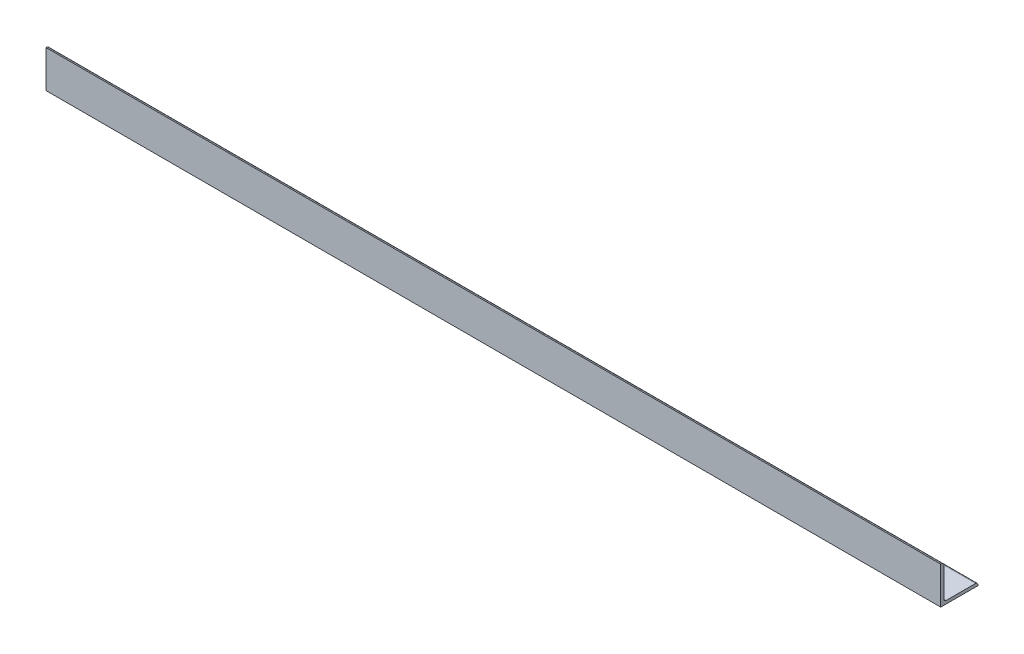
ISO-10303-21;
HEADER;
FILE_DESCRIPTION(('STEP AP214'),'2;1');
FILE_NAME('part.step','',(''),(''),'','','');
FILE_SCHEMA(('AUTOMOTIVE_DESIGN { 1 0 10303 214 1 1 1 1 }'));
ENDSEC;
DATA;
#1=APPLICATION_CONTEXT('core data for automotive mechanical design processes');
#2=APPLICATION_PROTOCOL_DEFINITION('international standard','automotive_design',2000,#1);
#3=PRODUCT_CONTEXT('',#1,'mechanical');
#4=PRODUCT('Part','Part','',(#3));
#5=PRODUCT_RELATED_PRODUCT_CATEGORY('part','',(#4));
#6=PRODUCT_DEFINITION_FORMATION('','',#4);
#7=PRODUCT_DEFINITION_CONTEXT('part definition',#1,'design');
#8=PRODUCT_DEFINITION('design','',#6,#7);
#9=PRODUCT_DEFINITION_SHAPE('','',#8);
#10=(LENGTH_UNIT() NAMED_UNIT(*) SI_UNIT(.MILLI.,.METRE.));
#11=(NAMED_UNIT(*) PLANE_ANGLE_UNIT() SI_UNIT($,.RADIAN.));
#12=(NAMED_UNIT(*) SI_UNIT($,.STERADIAN.) SOLID_ANGLE_UNIT());
#13=UNCERTAINTY_MEASURE_WITH_UNIT(LENGTH_MEASURE(1.E-05),#10,'distance_accuracy_value','');
#14=(GEOMETRIC_REPRESENTATION_CONTEXT(3) GLOBAL_UNCERTAINTY_ASSIGNED_CONTEXT((#13)) GLOBAL_UNIT_ASSIGNED_CONTEXT((#10,
#11,#12)) REPRESENTATION_CONTEXT('',''));
#15=CARTESIAN_POINT('',(0.,0.,0.));
#16=DIRECTION('',(0.,0.,1.));
#17=DIRECTION('',(1.,0.,0.));
#18=AXIS2_PLACEMENT_3D('',#15,#16,#17);
#19=CARTESIAN_POINT('',(-914.4,76.2,0.));
#20=DIRECTION('',(0.,1.,0.));
#21=DIRECTION('',(0.,0.,1.));
#22=AXIS2_PLACEMENT_3D('',#19,#20,#21);
#23=PLANE('',#22);
#24=DIRECTION('',(1.,0.,0.));
#25=VECTOR('',#24,1.);
#26=CARTESIAN_POINT('',(-914.4,76.2,0.));
#27=LINE('',#26,#25);
#28=CARTESIAN_POINT('',(-914.4,76.2,0.));
#29=VERTEX_POINT('',#28);
#30=CARTESIAN_POINT('',(914.4,76.2,0.));
#31=VERTEX_POINT('',#30);
#32=EDGE_CURVE('E41',#29,#31,#27,.T.);
#33=ORIENTED_EDGE('',*,*,#32,.T.);
#34=DIRECTION('',(0.,0.,1.));
#35=VECTOR('',#34,1.);
#36=CARTESIAN_POINT('',(914.4,76.2,0.));
#37=LINE('',#36,#35);
#38=CARTESIAN_POINT('',(914.4,76.2,-1.26999999999996));
#39=VERTEX_POINT('',#38);
#40=EDGE_CURVE('E109',#39,#31,#37,.T.);
#41=ORIENTED_EDGE('',*,*,#40,.F.);
#42=DIRECTION('',(1.,0.,0.));
#43=VECTOR('',#42,1.);
#44=CARTESIAN_POINT('',(-914.4,76.2,-1.26999999999996));
#45=LINE('',#44,#43);
#46=CARTESIAN_POINT('',(-914.4,76.2,-1.26999999999996));
#47=VERTEX_POINT('',#46);
#48=EDGE_CURVE('E11',#47,#39,#45,.T.);
#49=ORIENTED_EDGE('',*,*,#48,.F.);
#50=DIRECTION('',(0.,0.,1.));
#51=VECTOR('',#50,1.);
#52=CARTESIAN_POINT('',(-914.4,76.2,0.));
#53=LINE('',#52,#51);
#54=EDGE_CURVE('E110',#47,#29,#53,.T.);
#55=ORIENTED_EDGE('',*,*,#54,.T.);
#56=EDGE_LOOP('',(#33,#41,#49,#55));
#57=FACE_BOUND('',#56,.T.);
#58=ADVANCED_FACE('F38',(#57),#23,.T.);
#59=CARTESIAN_POINT('',(-914.4,71.12,-1.27));
#60=DIRECTION('',(1.,0.,0.));
#61=DIRECTION('',(0.,0.,-1.));
#62=AXIS2_PLACEMENT_3D('',#59,#60,#61);
#63=CYLINDRICAL_SURFACE('',#62,5.08);
#64=ORIENTED_EDGE('',*,*,#48,.T.);
#65=CARTESIAN_POINT('',(914.4,71.12,-1.27));
#66=DIRECTION('',(1.,0.,0.));
#67=DIRECTION('',(0.,0.,-1.));
#68=AXIS2_PLACEMENT_3D('',#65,#66,#67);
#69=CIRCLE('',#68,5.08);
#70=CARTESIAN_POINT('',(914.4,71.12,-6.35));
#71=VERTEX_POINT('',#70);
#72=EDGE_CURVE('E128',#71,#39,#69,.T.);
#73=ORIENTED_EDGE('',*,*,#72,.F.);
#74=DIRECTION('',(1.,0.,0.));
#75=VECTOR('',#74,1.);
#76=CARTESIAN_POINT('',(-914.4,71.12,-6.35));
#77=LINE('',#76,#75);
#78=CARTESIAN_POINT('',(-914.4,71.12,-6.35));
#79=VERTEX_POINT('',#78);
#80=EDGE_CURVE('E47',#79,#71,#77,.T.);
#81=ORIENTED_EDGE('',*,*,#80,.F.);
#82=CARTESIAN_POINT('',(-914.4,71.12,-1.27));
#83=DIRECTION('',(1.,0.,0.));
#84=DIRECTION('',(0.,0.,-1.));
#85=AXIS2_PLACEMENT_3D('',#82,#83,#84);
#86=CIRCLE('',#85,5.08);
#87=EDGE_CURVE('E116',#79,#47,#86,.T.);
#88=ORIENTED_EDGE('',*,*,#87,.T.);
#89=EDGE_LOOP('',(#64,#73,#81,#88));
#90=FACE_BOUND('',#89,.T.);
#91=ADVANCED_FACE('F211',(#90),#63,.T.);
#92=CARTESIAN_POINT('',(-914.4,71.12,-6.35));
#93=DIRECTION('',(0.,0.,-1.));
#94=DIRECTION('',(-1.,0.,0.));
#95=AXIS2_PLACEMENT_3D('',#92,#93,#94);
#96=PLANE('',#95);
#97=ORIENTED_EDGE('',*,*,#80,.T.);
#98=DIRECTION('',(0.,1.,0.));
#99=VECTOR('',#98,1.);
#100=CARTESIAN_POINT('',(914.4,71.12,-6.35));
#101=LINE('',#100,#99);
#102=CARTESIAN_POINT('',(914.4,11.43,-6.35));
#103=VERTEX_POINT('',#102);
#104=EDGE_CURVE('E144',#103,#71,#101,.T.);
#105=ORIENTED_EDGE('',*,*,#104,.F.);
#106=DIRECTION('',(1.,0.,0.));
#107=VECTOR('',#106,1.);
#108=CARTESIAN_POINT('',(-914.4,11.43,-6.35));
#109=LINE('',#108,#107);
#110=CARTESIAN_POINT('',(-914.4,11.43,-6.35));
#111=VERTEX_POINT('',#110);
#112=EDGE_CURVE('E170',#111,#103,#109,.T.);
#113=ORIENTED_EDGE('',*,*,#112,.F.);
#114=DIRECTION('',(0.,1.,0.));
#115=VECTOR('',#114,1.);
#116=CARTESIAN_POINT('',(-914.4,71.12,-6.35));
#117=LINE('',#116,#115);
#118=EDGE_CURVE('E165',#111,#79,#117,.T.);
#119=ORIENTED_EDGE('',*,*,#118,.T.);
#120=EDGE_LOOP('',(#97,#105,#113,#119));
#121=FACE_BOUND('',#120,.T.);
#122=ADVANCED_FACE('F209',(#121),#96,.T.);
#123=CARTESIAN_POINT('',(-914.4,11.43,-11.43));
#124=DIRECTION('',(1.,0.,0.));
#125=DIRECTION('',(0.,0.,-1.));
#126=AXIS2_PLACEMENT_3D('',#123,#124,#125);
#127=CYLINDRICAL_SURFACE('',#126,5.08);
#128=ORIENTED_EDGE('',*,*,#112,.T.);
#129=CARTESIAN_POINT('',(914.4,11.43,-11.43));
#130=DIRECTION('',(-1.,0.,0.));
#131=DIRECTION('',(0.,0.,-1.));
#132=AXIS2_PLACEMENT_3D('',#129,#130,#131);
#133=CIRCLE('',#132,5.08);
#134=CARTESIAN_POINT('',(914.4,6.35,-11.43));
#135=VERTEX_POINT('',#134);
#136=EDGE_CURVE('E141',#135,#103,#133,.T.);
#137=ORIENTED_EDGE('',*,*,#136,.F.);
#138=DIRECTION('',(1.,0.,0.));
#139=VECTOR('',#138,1.);
#140=CARTESIAN_POINT('',(-914.4,6.35,-11.43));
#141=LINE('',#140,#139);
#142=CARTESIAN_POINT('',(-914.4,6.35,-11.43));
#143=VERTEX_POINT('',#142);
#144=EDGE_CURVE('E173',#143,#135,#141,.T.);
#145=ORIENTED_EDGE('',*,*,#144,.F.);
#146=CARTESIAN_POINT('',(-914.4,11.43,-11.43));
#147=DIRECTION('',(-1.,0.,0.));
#148=DIRECTION('',(0.,0.,-1.));
#149=AXIS2_PLACEMENT_3D('',#146,#147,#148);
#150=CIRCLE('',#149,5.08);
#151=EDGE_CURVE('E162',#143,#111,#150,.T.);
#152=ORIENTED_EDGE('',*,*,#151,.T.);
#153=EDGE_LOOP('',(#128,#137,#145,#152));
#154=FACE_BOUND('',#153,.T.);
#155=ADVANCED_FACE('F207',(#154),#127,.F.);
#156=CARTESIAN_POINT('',(-914.4,6.35,-11.43));
#157=DIRECTION('',(0.,1.,0.));
#158=DIRECTION('',(0.,0.,1.));
#159=AXIS2_PLACEMENT_3D('',#156,#157,#158);
#160=PLANE('',#159);
#161=ORIENTED_EDGE('',*,*,#144,.T.);
#162=DIRECTION('',(0.,0.,1.));
#163=VECTOR('',#162,1.);
#164=CARTESIAN_POINT('',(914.4,6.35,-11.43));
#165=LINE('',#164,#163);
#166=CARTESIAN_POINT('',(914.4,6.35,-71.12));
#167=VERTEX_POINT('',#166);
#168=EDGE_CURVE('E138',#167,#135,#165,.T.);
#169=ORIENTED_EDGE('',*,*,#168,.F.);
#170=DIRECTION('',(1.,0.,0.));
#171=VECTOR('',#170,1.);
#172=CARTESIAN_POINT('',(-914.4,6.35,-71.12));
#173=LINE('',#172,#171);
#174=CARTESIAN_POINT('',(-914.4,6.35,-71.12));
#175=VERTEX_POINT('',#174);
#176=EDGE_CURVE('E176',#175,#167,#173,.T.);
#177=ORIENTED_EDGE('',*,*,#176,.F.);
#178=DIRECTION('',(0.,0.,1.));
#179=VECTOR('',#178,1.);
#180=CARTESIAN_POINT('',(-914.4,6.35,-11.43));
#181=LINE('',#180,#179);
#182=EDGE_CURVE('E159',#175,#143,#181,.T.);
#183=ORIENTED_EDGE('',*,*,#182,.T.);
#184=EDGE_LOOP('',(#161,#169,#177,#183));
#185=FACE_BOUND('',#184,.T.);
#186=ADVANCED_FACE('F202',(#185),#160,.T.);
#187=CARTESIAN_POINT('',(-914.4,1.27,-71.12));
#188=DIRECTION('',(1.,0.,0.));
#189=DIRECTION('',(0.,0.,-1.));
#190=AXIS2_PLACEMENT_3D('',#187,#188,#189);
#191=CYLINDRICAL_SURFACE('',#190,5.08);
#192=ORIENTED_EDGE('',*,*,#176,.T.);
#193=CARTESIAN_POINT('',(914.4,1.27,-71.12));
#194=DIRECTION('',(1.,0.,0.));
#195=DIRECTION('',(0.,0.,1.));
#196=AXIS2_PLACEMENT_3D('',#193,#194,#195);
#197=CIRCLE('',#196,5.08);
#198=CARTESIAN_POINT('',(914.4,1.26999999999996,-76.2));
#199=VERTEX_POINT('',#198);
#200=EDGE_CURVE('E135',#199,#167,#197,.T.);
#201=ORIENTED_EDGE('',*,*,#200,.F.);
#202=DIRECTION('',(1.,0.,0.));
#203=VECTOR('',#202,1.);
#204=CARTESIAN_POINT('',(-914.4,1.26999999999996,-76.2));
#205=LINE('',#204,#203);
#206=CARTESIAN_POINT('',(-914.4,1.26999999999996,-76.2));
#207=VERTEX_POINT('',#206);
#208=EDGE_CURVE('E179',#207,#199,#205,.T.);
#209=ORIENTED_EDGE('',*,*,#208,.F.);
#210=CARTESIAN_POINT('',(-914.4,1.27,-71.12));
#211=DIRECTION('',(1.,0.,0.));
#212=DIRECTION('',(0.,0.,1.));
#213=AXIS2_PLACEMENT_3D('',#210,#211,#212);
#214=CIRCLE('',#213,5.08);
#215=EDGE_CURVE('E156',#207,#175,#214,.T.);
#216=ORIENTED_EDGE('',*,*,#215,.T.);
#217=EDGE_LOOP('',(#192,#201,#209,#216));
#218=FACE_BOUND('',#217,.T.);
#219=ADVANCED_FACE('F195',(#218),#191,.T.);
#220=CARTESIAN_POINT('',(-914.4,1.26999999999996,-76.2));
#221=DIRECTION('',(0.,0.,-1.));
#222=DIRECTION('',(-1.,0.,0.));
#223=AXIS2_PLACEMENT_3D('',#220,#221,#222);
#224=PLANE('',#223);
#225=ORIENTED_EDGE('',*,*,#208,.T.);
#226=DIRECTION('',(0.,1.,0.));
#227=VECTOR('',#226,1.);
#228=CARTESIAN_POINT('',(914.4,1.26999999999996,-76.2));
#229=LINE('',#228,#227);
#230=CARTESIAN_POINT('',(914.4,0.,-76.2));
#231=VERTEX_POINT('',#230);
#232=EDGE_CURVE('E132',#231,#199,#229,.T.);
#233=ORIENTED_EDGE('',*,*,#232,.F.);
#234=DIRECTION('',(1.,0.,0.));
#235=VECTOR('',#234,1.);
#236=CARTESIAN_POINT('',(-914.4,0.,-76.2));
#237=LINE('',#236,#235);
#238=CARTESIAN_POINT('',(-914.4,0.,-76.2));
#239=VERTEX_POINT('',#238);
#240=EDGE_CURVE('E182',#239,#231,#237,.T.);
#241=ORIENTED_EDGE('',*,*,#240,.F.);
#242=DIRECTION('',(0.,1.,0.));
#243=VECTOR('',#242,1.);
#244=CARTESIAN_POINT('',(-914.4,1.26999999999996,-76.2));
#245=LINE('',#244,#243);
#246=EDGE_CURVE('E153',#239,#207,#245,.T.);
#247=ORIENTED_EDGE('',*,*,#246,.T.);
#248=EDGE_LOOP('',(#225,#233,#241,#247));
#249=FACE_BOUND('',#248,.T.);
#250=ADVANCED_FACE('F192',(#249),#224,.T.);
#251=CARTESIAN_POINT('',(-914.4,0.,0.));
#252=DIRECTION('',(0.,-1.,0.));
#253=DIRECTION('',(0.,0.,-1.));
#254=AXIS2_PLACEMENT_3D('',#251,#252,#253);
#255=PLANE('',#254);
#256=ORIENTED_EDGE('',*,*,#240,.T.);
#257=DIRECTION('',(0.,0.,-1.));
#258=VECTOR('',#257,1.);
#259=CARTESIAN_POINT('',(914.4,0.,0.));
#260=LINE('',#259,#258);
#261=CARTESIAN_POINT('',(914.4,0.,0.));
#262=VERTEX_POINT('',#261);
#263=EDGE_CURVE('E123',#262,#231,#260,.T.);
#264=ORIENTED_EDGE('',*,*,#263,.F.);
#265=DIRECTION('',(1.,0.,0.));
#266=VECTOR('',#265,1.);
#267=CARTESIAN_POINT('',(-914.4,0.,0.));
#268=LINE('',#267,#266);
#269=CARTESIAN_POINT('',(-914.4,0.,0.));
#270=VERTEX_POINT('',#269);
#271=EDGE_CURVE('E115',#270,#262,#268,.T.);
#272=ORIENTED_EDGE('',*,*,#271,.F.);
#273=DIRECTION('',(0.,0.,-1.));
#274=VECTOR('',#273,1.);
#275=CARTESIAN_POINT('',(-914.4,0.,0.));
#276=LINE('',#275,#274);
#277=EDGE_CURVE('E150',#270,#239,#276,.T.);
#278=ORIENTED_EDGE('',*,*,#277,.T.);
#279=EDGE_LOOP('',(#256,#264,#272,#278));
#280=FACE_BOUND('',#279,.T.);
#281=ADVANCED_FACE('F186',(#280),#255,.T.);
#282=CARTESIAN_POINT('',(-914.4,76.2,0.));
#283=DIRECTION('',(0.,0.,1.));
#284=DIRECTION('',(1.,0.,0.));
#285=AXIS2_PLACEMENT_3D('',#282,#283,#284);
#286=PLANE('',#285);
#287=ORIENTED_EDGE('',*,*,#271,.T.);
#288=DIRECTION('',(0.,-1.,0.));
#289=VECTOR('',#288,1.);
#290=CARTESIAN_POINT('',(914.4,76.2,0.));
#291=LINE('',#290,#289);
#292=EDGE_CURVE('E118',#31,#262,#291,.T.);
#293=ORIENTED_EDGE('',*,*,#292,.F.);
#294=ORIENTED_EDGE('',*,*,#32,.F.);
#295=DIRECTION('',(0.,-1.,0.));
#296=VECTOR('',#295,1.);
#297=CARTESIAN_POINT('',(-914.4,76.2,0.));
#298=LINE('',#297,#296);
#299=EDGE_CURVE('E148',#29,#270,#298,.T.);
#300=ORIENTED_EDGE('',*,*,#299,.T.);
#301=EDGE_LOOP('',(#287,#293,#294,#300));
#302=FACE_BOUND('',#301,.T.);
#303=ADVANCED_FACE('F119',(#302),#286,.T.);
#304=CARTESIAN_POINT('',(-914.4,71.12,-1.27));
#305=DIRECTION('',(1.,0.,0.));
#306=DIRECTION('',(0.,0.,-1.));
#307=AXIS2_PLACEMENT_3D('',#304,#305,#306);
#308=PLANE('',#307);
#309=ORIENTED_EDGE('',*,*,#54,.F.);
#310=ORIENTED_EDGE('',*,*,#87,.F.);
#311=ORIENTED_EDGE('',*,*,#118,.F.);
#312=ORIENTED_EDGE('',*,*,#151,.F.);
#313=ORIENTED_EDGE('',*,*,#182,.F.);
#314=ORIENTED_EDGE('',*,*,#215,.F.);
#315=ORIENTED_EDGE('',*,*,#246,.F.);
#316=ORIENTED_EDGE('',*,*,#277,.F.);
#317=ORIENTED_EDGE('',*,*,#299,.F.);
#318=EDGE_LOOP('',(#309,#310,#311,#312,#313,#314,#315,#316,#317));
#319=FACE_BOUND('',#318,.T.);
#320=ADVANCED_FACE('F198',(#319),#308,.F.);
#321=CARTESIAN_POINT('',(914.4,71.12,-1.27));
#322=DIRECTION('',(1.,0.,0.));
#323=DIRECTION('',(0.,0.,-1.));
#324=AXIS2_PLACEMENT_3D('',#321,#322,#323);
#325=PLANE('',#324);
#326=ORIENTED_EDGE('',*,*,#40,.T.);
#327=ORIENTED_EDGE('',*,*,#292,.T.);
#328=ORIENTED_EDGE('',*,*,#263,.T.);
#329=ORIENTED_EDGE('',*,*,#232,.T.);
#330=ORIENTED_EDGE('',*,*,#200,.T.);
#331=ORIENTED_EDGE('',*,*,#168,.T.);
#332=ORIENTED_EDGE('',*,*,#136,.T.);
#333=ORIENTED_EDGE('',*,*,#104,.T.);
#334=ORIENTED_EDGE('',*,*,#72,.T.);
#335=EDGE_LOOP('',(#326,#327,#328,#329,#330,#331,#332,#333,#334));
#336=FACE_BOUND('',#335,.T.);
#337=ADVANCED_FACE('F126',(#336),#325,.T.);
#338=CLOSED_SHELL('',(#58,#91,#122,#155,#186,#219,#250,#281,#303,#320,#337));
#339=MANIFOLD_SOLID_BREP('B2',#338);
#340=ADVANCED_BREP_SHAPE_REPRESENTATION('',(#18,#339),#14);
#341=SHAPE_DEFINITION_REPRESENTATION(#9,#340);
ENDSEC;
END-ISO-10303-21;
